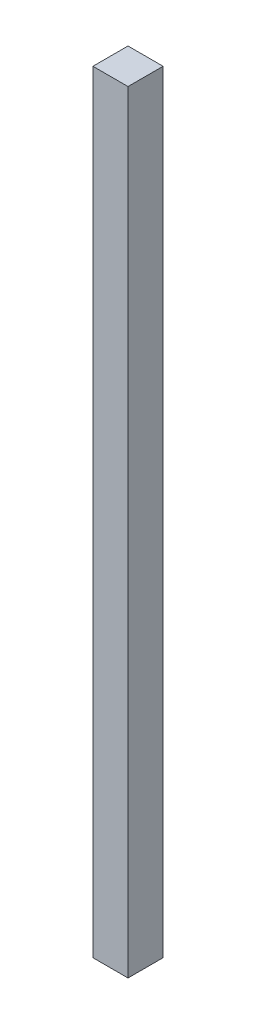
ISO-10303-21;
HEADER;
FILE_DESCRIPTION(('STEP AP214'),'2;1');
FILE_NAME('part.step','',(''),(''),'','','');
FILE_SCHEMA(('AUTOMOTIVE_DESIGN { 1 0 10303 214 1 1 1 1 }'));
ENDSEC;
DATA;
#1=APPLICATION_CONTEXT('core data for automotive mechanical design processes');
#2=APPLICATION_PROTOCOL_DEFINITION('international standard','automotive_design',2000,#1);
#3=PRODUCT_CONTEXT('',#1,'mechanical');
#4=PRODUCT('Part','Part','',(#3));
#5=PRODUCT_RELATED_PRODUCT_CATEGORY('part','',(#4));
#6=PRODUCT_DEFINITION_FORMATION('','',#4);
#7=PRODUCT_DEFINITION_CONTEXT('part definition',#1,'design');
#8=PRODUCT_DEFINITION('design','',#6,#7);
#9=PRODUCT_DEFINITION_SHAPE('','',#8);
#10=(LENGTH_UNIT() NAMED_UNIT(*) SI_UNIT(.MILLI.,.METRE.));
#11=(NAMED_UNIT(*) PLANE_ANGLE_UNIT() SI_UNIT($,.RADIAN.));
#12=(NAMED_UNIT(*) SI_UNIT($,.STERADIAN.) SOLID_ANGLE_UNIT());
#13=UNCERTAINTY_MEASURE_WITH_UNIT(LENGTH_MEASURE(1.E-05),#10,'distance_accuracy_value','');
#14=(GEOMETRIC_REPRESENTATION_CONTEXT(3) GLOBAL_UNCERTAINTY_ASSIGNED_CONTEXT((#13)) GLOBAL_UNIT_ASSIGNED_CONTEXT((#10,
#11,#12)) REPRESENTATION_CONTEXT('',''));
#15=CARTESIAN_POINT('',(0.,0.,0.));
#16=DIRECTION('',(0.,0.,1.));
#17=DIRECTION('',(1.,0.,0.));
#18=AXIS2_PLACEMENT_3D('',#15,#16,#17);
#19=CARTESIAN_POINT('',(10.,440.,-10.));
#20=DIRECTION('',(-1.,0.,0.));
#21=DIRECTION('',(0.,0.,1.));
#22=AXIS2_PLACEMENT_3D('',#19,#20,#21);
#23=PLANE('',#22);
#24=DIRECTION('',(0.,0.,-1.));
#25=VECTOR('',#24,1.);
#26=CARTESIAN_POINT('',(10.,0.,-10.));
#27=LINE('',#26,#25);
#28=CARTESIAN_POINT('',(10.,0.,9.99999999999999));
#29=VERTEX_POINT('',#28);
#30=CARTESIAN_POINT('',(10.,0.,-10.));
#31=VERTEX_POINT('',#30);
#32=EDGE_CURVE('E96',#29,#31,#27,.T.);
#33=ORIENTED_EDGE('',*,*,#32,.T.);
#34=DIRECTION('',(0.,-1.,0.));
#35=VECTOR('',#34,1.);
#36=CARTESIAN_POINT('',(10.,440.,-10.));
#37=LINE('',#36,#35);
#38=CARTESIAN_POINT('',(10.,440.,-10.));
#39=VERTEX_POINT('',#38);
#40=EDGE_CURVE('E11',#39,#31,#37,.T.);
#41=ORIENTED_EDGE('',*,*,#40,.F.);
#42=DIRECTION('',(0.,0.,-1.));
#43=VECTOR('',#42,1.);
#44=CARTESIAN_POINT('',(10.,440.,-10.));
#45=LINE('',#44,#43);
#46=CARTESIAN_POINT('',(10.,440.,9.99999999999999));
#47=VERTEX_POINT('',#46);
#48=EDGE_CURVE('E84',#47,#39,#45,.T.);
#49=ORIENTED_EDGE('',*,*,#48,.F.);
#50=DIRECTION('',(0.,-1.,0.));
#51=VECTOR('',#50,1.);
#52=CARTESIAN_POINT('',(10.,440.,9.99999999999999));
#53=LINE('',#52,#51);
#54=EDGE_CURVE('E92',#47,#29,#53,.T.);
#55=ORIENTED_EDGE('',*,*,#54,.T.);
#56=EDGE_LOOP('',(#33,#41,#49,#55));
#57=FACE_BOUND('',#56,.T.);
#58=ADVANCED_FACE('F33',(#57),#23,.F.);
#59=CARTESIAN_POINT('',(-10.,440.,-10.));
#60=DIRECTION('',(0.,0.,1.));
#61=DIRECTION('',(1.,0.,0.));
#62=AXIS2_PLACEMENT_3D('',#59,#60,#61);
#63=PLANE('',#62);
#64=DIRECTION('',(-1.,0.,0.));
#65=VECTOR('',#64,1.);
#66=CARTESIAN_POINT('',(-10.,0.,-10.));
#67=LINE('',#66,#65);
#68=CARTESIAN_POINT('',(-10.,0.,-10.));
#69=VERTEX_POINT('',#68);
#70=EDGE_CURVE('E88',#31,#69,#67,.T.);
#71=ORIENTED_EDGE('',*,*,#70,.T.);
#72=DIRECTION('',(0.,-1.,0.));
#73=VECTOR('',#72,1.);
#74=CARTESIAN_POINT('',(-10.,440.,-10.));
#75=LINE('',#74,#73);
#76=CARTESIAN_POINT('',(-10.,440.,-10.));
#77=VERTEX_POINT('',#76);
#78=EDGE_CURVE('E41',#77,#69,#75,.T.);
#79=ORIENTED_EDGE('',*,*,#78,.F.);
#80=DIRECTION('',(-1.,0.,0.));
#81=VECTOR('',#80,1.);
#82=CARTESIAN_POINT('',(-10.,440.,-10.));
#83=LINE('',#82,#81);
#84=EDGE_CURVE('E79',#39,#77,#83,.T.);
#85=ORIENTED_EDGE('',*,*,#84,.F.);
#86=ORIENTED_EDGE('',*,*,#40,.T.);
#87=EDGE_LOOP('',(#71,#79,#85,#86));
#88=FACE_BOUND('',#87,.T.);
#89=ADVANCED_FACE('F87',(#88),#63,.F.);
#90=CARTESIAN_POINT('',(-10.,440.,-10.));
#91=DIRECTION('',(1.,0.,0.));
#92=DIRECTION('',(0.,0.,-1.));
#93=AXIS2_PLACEMENT_3D('',#90,#91,#92);
#94=PLANE('',#93);
#95=DIRECTION('',(0.,0.,1.));
#96=VECTOR('',#95,1.);
#97=CARTESIAN_POINT('',(-10.,0.,-10.));
#98=LINE('',#97,#96);
#99=CARTESIAN_POINT('',(-10.,0.,9.99999999999999));
#100=VERTEX_POINT('',#99);
#101=EDGE_CURVE('E66',#69,#100,#98,.T.);
#102=ORIENTED_EDGE('',*,*,#101,.T.);
#103=DIRECTION('',(0.,-1.,0.));
#104=VECTOR('',#103,1.);
#105=CARTESIAN_POINT('',(-10.,440.,9.99999999999999));
#106=LINE('',#105,#104);
#107=CARTESIAN_POINT('',(-10.,440.,9.99999999999999));
#108=VERTEX_POINT('',#107);
#109=EDGE_CURVE('E89',#108,#100,#106,.T.);
#110=ORIENTED_EDGE('',*,*,#109,.F.);
#111=DIRECTION('',(0.,0.,1.));
#112=VECTOR('',#111,1.);
#113=CARTESIAN_POINT('',(-10.,440.,-10.));
#114=LINE('',#113,#112);
#115=EDGE_CURVE('E82',#77,#108,#114,.T.);
#116=ORIENTED_EDGE('',*,*,#115,.F.);
#117=ORIENTED_EDGE('',*,*,#78,.T.);
#118=EDGE_LOOP('',(#102,#110,#116,#117));
#119=FACE_BOUND('',#118,.T.);
#120=ADVANCED_FACE('F90',(#119),#94,.F.);
#121=CARTESIAN_POINT('',(-10.,440.,9.99999999999999));
#122=DIRECTION('',(0.,0.,-1.));
#123=DIRECTION('',(-1.,0.,0.));
#124=AXIS2_PLACEMENT_3D('',#121,#122,#123);
#125=PLANE('',#124);
#126=DIRECTION('',(1.,0.,0.));
#127=VECTOR('',#126,1.);
#128=CARTESIAN_POINT('',(-10.,0.,9.99999999999999));
#129=LINE('',#128,#127);
#130=EDGE_CURVE('E72',#100,#29,#129,.T.);
#131=ORIENTED_EDGE('',*,*,#130,.T.);
#132=ORIENTED_EDGE('',*,*,#54,.F.);
#133=DIRECTION('',(1.,0.,0.));
#134=VECTOR('',#133,1.);
#135=CARTESIAN_POINT('',(-10.,440.,9.99999999999999));
#136=LINE('',#135,#134);
#137=EDGE_CURVE('E49',#108,#47,#136,.T.);
#138=ORIENTED_EDGE('',*,*,#137,.F.);
#139=ORIENTED_EDGE('',*,*,#109,.T.);
#140=EDGE_LOOP('',(#131,#132,#138,#139));
#141=FACE_BOUND('',#140,.T.);
#142=ADVANCED_FACE('F103',(#141),#125,.F.);
#143=CARTESIAN_POINT('',(0.,440.,0.));
#144=DIRECTION('',(0.,1.,0.));
#145=DIRECTION('',(0.,0.,1.));
#146=AXIS2_PLACEMENT_3D('',#143,#144,#145);
#147=PLANE('',#146);
#148=ORIENTED_EDGE('',*,*,#48,.T.);
#149=ORIENTED_EDGE('',*,*,#84,.T.);
#150=ORIENTED_EDGE('',*,*,#115,.T.);
#151=ORIENTED_EDGE('',*,*,#137,.T.);
#152=EDGE_LOOP('',(#148,#149,#150,#151));
#153=FACE_BOUND('',#152,.T.);
#154=ADVANCED_FACE('F80',(#153),#147,.T.);
#155=CARTESIAN_POINT('',(0.,0.,0.));
#156=DIRECTION('',(0.,1.,0.));
#157=DIRECTION('',(0.,0.,1.));
#158=AXIS2_PLACEMENT_3D('',#155,#156,#157);
#159=PLANE('',#158);
#160=ORIENTED_EDGE('',*,*,#32,.F.);
#161=ORIENTED_EDGE('',*,*,#130,.F.);
#162=ORIENTED_EDGE('',*,*,#101,.F.);
#163=ORIENTED_EDGE('',*,*,#70,.F.);
#164=EDGE_LOOP('',(#160,#161,#162,#163));
#165=FACE_BOUND('',#164,.T.);
#166=ADVANCED_FACE('F106',(#165),#159,.F.);
#167=CLOSED_SHELL('',(#58,#89,#120,#142,#154,#166));
#168=MANIFOLD_SOLID_BREP('B2',#167);
#169=ADVANCED_BREP_SHAPE_REPRESENTATION('',(#18,#168),#14);
#170=SHAPE_DEFINITION_REPRESENTATION(#9,#169);
ENDSEC;
END-ISO-10303-21;
